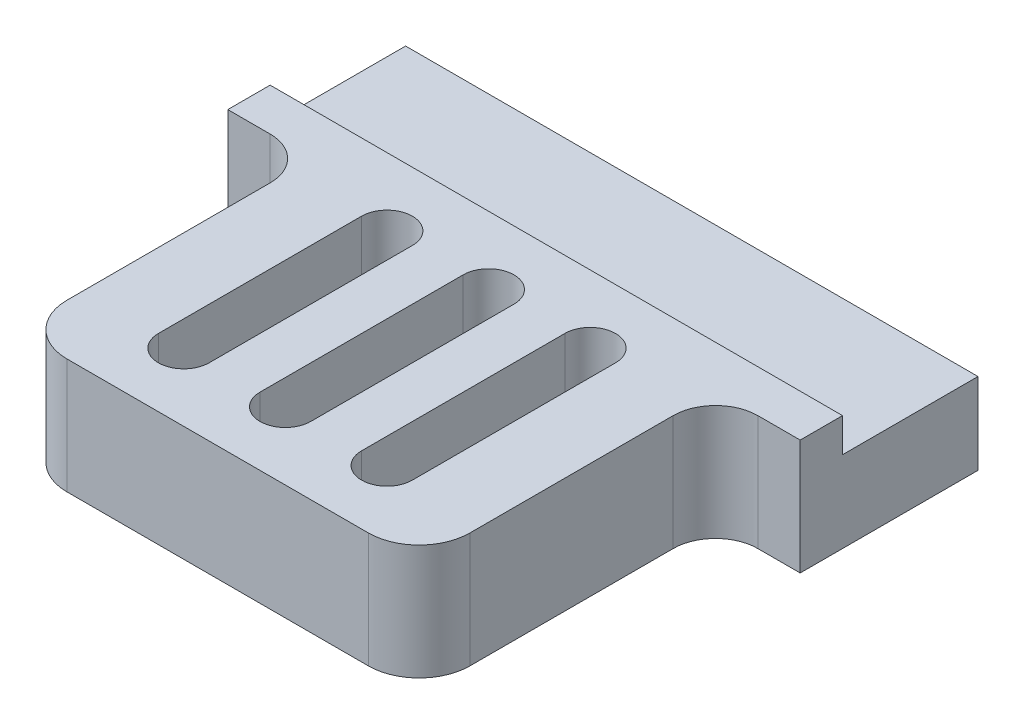
ISO-10303-21;
HEADER;
FILE_DESCRIPTION(('STEP AP214'),'2;1');
FILE_NAME('part.step','',(''),(''),'','','');
FILE_SCHEMA(('AUTOMOTIVE_DESIGN { 1 0 10303 214 1 1 1 1 }'));
ENDSEC;
DATA;
#1=APPLICATION_CONTEXT('core data for automotive mechanical design processes');
#2=APPLICATION_PROTOCOL_DEFINITION('international standard','automotive_design',2000,#1);
#3=PRODUCT_CONTEXT('',#1,'mechanical');
#4=PRODUCT('Part','Part','',(#3));
#5=PRODUCT_RELATED_PRODUCT_CATEGORY('part','',(#4));
#6=PRODUCT_DEFINITION_FORMATION('','',#4);
#7=PRODUCT_DEFINITION_CONTEXT('part definition',#1,'design');
#8=PRODUCT_DEFINITION('design','',#6,#7);
#9=PRODUCT_DEFINITION_SHAPE('','',#8);
#10=(LENGTH_UNIT() NAMED_UNIT(*) SI_UNIT(.MILLI.,.METRE.));
#11=(NAMED_UNIT(*) PLANE_ANGLE_UNIT() SI_UNIT($,.RADIAN.));
#12=(NAMED_UNIT(*) SI_UNIT($,.STERADIAN.) SOLID_ANGLE_UNIT());
#13=UNCERTAINTY_MEASURE_WITH_UNIT(LENGTH_MEASURE(1.E-05),#10,'distance_accuracy_value','');
#14=(GEOMETRIC_REPRESENTATION_CONTEXT(3) GLOBAL_UNCERTAINTY_ASSIGNED_CONTEXT((#13)) GLOBAL_UNIT_ASSIGNED_CONTEXT((#10,
#11,#12)) REPRESENTATION_CONTEXT('',''));
#15=CARTESIAN_POINT('',(0.,0.,0.));
#16=DIRECTION('',(0.,0.,1.));
#17=DIRECTION('',(1.,0.,0.));
#18=AXIS2_PLACEMENT_3D('',#15,#16,#17);
#19=CARTESIAN_POINT('',(-16.9,2.4,28.));
#20=DIRECTION('',(1.,0.,0.));
#21=DIRECTION('',(0.,0.,-1.));
#22=AXIS2_PLACEMENT_3D('',#19,#20,#21);
#23=PLANE('',#22);
#24=DIRECTION('',(0.,0.,-1.));
#25=VECTOR('',#24,1.);
#26=CARTESIAN_POINT('',(-16.9,-2.4,28.));
#27=LINE('',#26,#25);
#28=CARTESIAN_POINT('',(-16.9,-2.4,10.5));
#29=VERTEX_POINT('',#28);
#30=CARTESIAN_POINT('',(-16.9,-2.4,0.));
#31=VERTEX_POINT('',#30);
#32=EDGE_CURVE('E233',#29,#31,#27,.T.);
#33=ORIENTED_EDGE('',*,*,#32,.F.);
#34=DIRECTION('',(0.,1.,0.));
#35=VECTOR('',#34,1.);
#36=CARTESIAN_POINT('',(-16.9,-2.4,10.5));
#37=LINE('',#36,#35);
#38=CARTESIAN_POINT('',(-16.9,4.4,10.5));
#39=VERTEX_POINT('',#38);
#40=EDGE_CURVE('E294',#29,#39,#37,.T.);
#41=ORIENTED_EDGE('',*,*,#40,.T.);
#42=DIRECTION('',(0.,0.,1.));
#43=VECTOR('',#42,1.);
#44=CARTESIAN_POINT('',(-16.9,4.4,8.));
#45=LINE('',#44,#43);
#46=CARTESIAN_POINT('',(-16.9,4.4,8.));
#47=VERTEX_POINT('',#46);
#48=EDGE_CURVE('E409',#47,#39,#45,.T.);
#49=ORIENTED_EDGE('',*,*,#48,.F.);
#50=DIRECTION('',(0.,-1.,0.));
#51=VECTOR('',#50,1.);
#52=CARTESIAN_POINT('',(-16.9,2.4,8.));
#53=LINE('',#52,#51);
#54=CARTESIAN_POINT('',(-16.9,2.4,8.));
#55=VERTEX_POINT('',#54);
#56=EDGE_CURVE('E396',#47,#55,#53,.T.);
#57=ORIENTED_EDGE('',*,*,#56,.T.);
#58=DIRECTION('',(0.,0.,-1.));
#59=VECTOR('',#58,1.);
#60=CARTESIAN_POINT('',(-16.9,2.4,28.));
#61=LINE('',#60,#59);
#62=CARTESIAN_POINT('',(-16.9,2.4,0.));
#63=VERTEX_POINT('',#62);
#64=EDGE_CURVE('E238',#55,#63,#61,.T.);
#65=ORIENTED_EDGE('',*,*,#64,.T.);
#66=DIRECTION('',(0.,-1.,0.));
#67=VECTOR('',#66,1.);
#68=CARTESIAN_POINT('',(-16.9,2.4,0.));
#69=LINE('',#68,#67);
#70=EDGE_CURVE('E412',#63,#31,#69,.T.);
#71=ORIENTED_EDGE('',*,*,#70,.T.);
#72=EDGE_LOOP('',(#33,#41,#49,#57,#65,#71));
#73=FACE_BOUND('',#72,.T.);
#74=ADVANCED_FACE('F33',(#73),#23,.F.);
#75=CARTESIAN_POINT('',(-16.9,-2.4,28.));
#76=DIRECTION('',(0.,1.,0.));
#77=DIRECTION('',(-1.,0.,0.));
#78=AXIS2_PLACEMENT_3D('',#75,#76,#77);
#79=PLANE('',#78);
#80=DIRECTION('',(0.,0.,-1.));
#81=VECTOR('',#80,1.);
#82=CARTESIAN_POINT('',(7.5,-2.4,12.));
#83=LINE('',#82,#81);
#84=CARTESIAN_POINT('',(7.5,-2.4,24.));
#85=VERTEX_POINT('',#84);
#86=CARTESIAN_POINT('',(7.5,-2.4,12.));
#87=VERTEX_POINT('',#86);
#88=EDGE_CURVE('E310',#85,#87,#83,.T.);
#89=ORIENTED_EDGE('',*,*,#88,.T.);
#90=CARTESIAN_POINT('',(6.,-2.4,12.));
#91=DIRECTION('',(0.,1.,0.));
#92=DIRECTION('',(0.,0.,1.));
#93=AXIS2_PLACEMENT_3D('',#90,#91,#92);
#94=CIRCLE('',#93,1.5);
#95=CARTESIAN_POINT('',(4.5,-2.4,12.));
#96=VERTEX_POINT('',#95);
#97=EDGE_CURVE('E300',#87,#96,#94,.T.);
#98=ORIENTED_EDGE('',*,*,#97,.T.);
#99=DIRECTION('',(0.,0.,1.));
#100=VECTOR('',#99,1.);
#101=CARTESIAN_POINT('',(4.5,-2.4,12.));
#102=LINE('',#101,#100);
#103=CARTESIAN_POINT('',(4.5,-2.4,24.));
#104=VERTEX_POINT('',#103);
#105=EDGE_CURVE('E303',#96,#104,#102,.T.);
#106=ORIENTED_EDGE('',*,*,#105,.T.);
#107=CARTESIAN_POINT('',(6.,-2.4,24.));
#108=DIRECTION('',(0.,1.,0.));
#109=DIRECTION('',(0.,0.,1.));
#110=AXIS2_PLACEMENT_3D('',#107,#108,#109);
#111=CIRCLE('',#110,1.5);
#112=EDGE_CURVE('E307',#104,#85,#111,.T.);
#113=ORIENTED_EDGE('',*,*,#112,.T.);
#114=EDGE_LOOP('',(#89,#98,#106,#113));
#115=FACE_BOUND('',#114,.T.);
#116=DIRECTION('',(0.,0.,-1.));
#117=VECTOR('',#116,1.);
#118=CARTESIAN_POINT('',(-4.5,-2.4,12.));
#119=LINE('',#118,#117);
#120=CARTESIAN_POINT('',(-4.5,-2.4,24.));
#121=VERTEX_POINT('',#120);
#122=CARTESIAN_POINT('',(-4.5,-2.4,12.));
#123=VERTEX_POINT('',#122);
#124=EDGE_CURVE('E344',#121,#123,#119,.T.);
#125=ORIENTED_EDGE('',*,*,#124,.T.);
#126=CARTESIAN_POINT('',(-6.,-2.4,12.));
#127=DIRECTION('',(0.,1.,0.));
#128=DIRECTION('',(0.,0.,1.));
#129=AXIS2_PLACEMENT_3D('',#126,#127,#128);
#130=CIRCLE('',#129,1.5);
#131=CARTESIAN_POINT('',(-7.5,-2.4,12.));
#132=VERTEX_POINT('',#131);
#133=EDGE_CURVE('E334',#123,#132,#130,.T.);
#134=ORIENTED_EDGE('',*,*,#133,.T.);
#135=DIRECTION('',(0.,0.,1.));
#136=VECTOR('',#135,1.);
#137=CARTESIAN_POINT('',(-7.5,-2.4,12.));
#138=LINE('',#137,#136);
#139=CARTESIAN_POINT('',(-7.5,-2.4,24.));
#140=VERTEX_POINT('',#139);
#141=EDGE_CURVE('E337',#132,#140,#138,.T.);
#142=ORIENTED_EDGE('',*,*,#141,.T.);
#143=CARTESIAN_POINT('',(-6.,-2.4,24.));
#144=DIRECTION('',(0.,1.,0.));
#145=DIRECTION('',(0.,0.,1.));
#146=AXIS2_PLACEMENT_3D('',#143,#144,#145);
#147=CIRCLE('',#146,1.5);
#148=EDGE_CURVE('E341',#140,#121,#147,.T.);
#149=ORIENTED_EDGE('',*,*,#148,.T.);
#150=EDGE_LOOP('',(#125,#134,#142,#149));
#151=FACE_BOUND('',#150,.T.);
#152=DIRECTION('',(0.,0.,-1.));
#153=VECTOR('',#152,1.);
#154=CARTESIAN_POINT('',(1.5,-2.4,12.));
#155=LINE('',#154,#153);
#156=CARTESIAN_POINT('',(1.5,-2.4,24.));
#157=VERTEX_POINT('',#156);
#158=CARTESIAN_POINT('',(1.5,-2.4,12.));
#159=VERTEX_POINT('',#158);
#160=EDGE_CURVE('E374',#157,#159,#155,.T.);
#161=ORIENTED_EDGE('',*,*,#160,.T.);
#162=CARTESIAN_POINT('',(0.,-2.4,12.));
#163=DIRECTION('',(0.,1.,0.));
#164=DIRECTION('',(0.,0.,1.));
#165=AXIS2_PLACEMENT_3D('',#162,#163,#164);
#166=CIRCLE('',#165,1.5);
#167=CARTESIAN_POINT('',(-1.5,-2.4,12.));
#168=VERTEX_POINT('',#167);
#169=EDGE_CURVE('E364',#159,#168,#166,.T.);
#170=ORIENTED_EDGE('',*,*,#169,.T.);
#171=DIRECTION('',(0.,0.,1.));
#172=VECTOR('',#171,1.);
#173=CARTESIAN_POINT('',(-1.5,-2.4,12.));
#174=LINE('',#173,#172);
#175=CARTESIAN_POINT('',(-1.5,-2.4,24.));
#176=VERTEX_POINT('',#175);
#177=EDGE_CURVE('E367',#168,#176,#174,.T.);
#178=ORIENTED_EDGE('',*,*,#177,.T.);
#179=CARTESIAN_POINT('',(0.,-2.4,24.));
#180=DIRECTION('',(0.,1.,0.));
#181=DIRECTION('',(0.,0.,1.));
#182=AXIS2_PLACEMENT_3D('',#179,#180,#181);
#183=CIRCLE('',#182,1.5);
#184=EDGE_CURVE('E371',#176,#157,#183,.T.);
#185=ORIENTED_EDGE('',*,*,#184,.T.);
#186=EDGE_LOOP('',(#161,#170,#178,#185));
#187=FACE_BOUND('',#186,.T.);
#188=DIRECTION('',(-1.,0.,0.));
#189=VECTOR('',#188,1.);
#190=CARTESIAN_POINT('',(16.9,-2.4,10.5));
#191=LINE('',#190,#189);
#192=CARTESIAN_POINT('',(16.9,-2.4,10.5));
#193=VERTEX_POINT('',#192);
#194=CARTESIAN_POINT('',(14.4,-2.4,10.5));
#195=VERTEX_POINT('',#194);
#196=EDGE_CURVE('E205',#193,#195,#191,.T.);
#197=ORIENTED_EDGE('',*,*,#196,.T.);
#198=CARTESIAN_POINT('',(14.4,-2.4,13.));
#199=DIRECTION('',(0.,1.,0.));
#200=DIRECTION('',(-1.,0.,0.));
#201=AXIS2_PLACEMENT_3D('',#198,#199,#200);
#202=CIRCLE('',#201,2.5);
#203=CARTESIAN_POINT('',(11.9,-2.4,13.));
#204=VERTEX_POINT('',#203);
#205=EDGE_CURVE('E271',#195,#204,#202,.T.);
#206=ORIENTED_EDGE('',*,*,#205,.T.);
#207=DIRECTION('',(0.,0.,1.));
#208=VECTOR('',#207,1.);
#209=CARTESIAN_POINT('',(11.9,-2.4,10.5));
#210=LINE('',#209,#208);
#211=CARTESIAN_POINT('',(11.9,-2.4,25.));
#212=VERTEX_POINT('',#211);
#213=EDGE_CURVE('E216',#204,#212,#210,.T.);
#214=ORIENTED_EDGE('',*,*,#213,.T.);
#215=CARTESIAN_POINT('',(8.9,-2.4,25.));
#216=DIRECTION('',(0.,1.,0.));
#217=DIRECTION('',(-1.,0.,0.));
#218=AXIS2_PLACEMENT_3D('',#215,#216,#217);
#219=CIRCLE('',#218,3.);
#220=CARTESIAN_POINT('',(8.9,-2.4,28.));
#221=VERTEX_POINT('',#220);
#222=EDGE_CURVE('E256',#212,#221,#219,.F.);
#223=ORIENTED_EDGE('',*,*,#222,.T.);
#224=DIRECTION('',(1.,0.,0.));
#225=VECTOR('',#224,1.);
#226=CARTESIAN_POINT('',(-16.9,-2.4,28.));
#227=LINE('',#226,#225);
#228=CARTESIAN_POINT('',(-8.9,-2.4,28.));
#229=VERTEX_POINT('',#228);
#230=EDGE_CURVE('E414',#229,#221,#227,.T.);
#231=ORIENTED_EDGE('',*,*,#230,.F.);
#232=CARTESIAN_POINT('',(-8.9,-2.4,25.));
#233=DIRECTION('',(0.,1.,0.));
#234=DIRECTION('',(-1.,0.,0.));
#235=AXIS2_PLACEMENT_3D('',#232,#233,#234);
#236=CIRCLE('',#235,3.);
#237=CARTESIAN_POINT('',(-11.9,-2.4,25.));
#238=VERTEX_POINT('',#237);
#239=EDGE_CURVE('E254',#229,#238,#236,.F.);
#240=ORIENTED_EDGE('',*,*,#239,.T.);
#241=DIRECTION('',(0.,0.,-1.));
#242=VECTOR('',#241,1.);
#243=CARTESIAN_POINT('',(-11.9,-2.4,10.5));
#244=LINE('',#243,#242);
#245=CARTESIAN_POINT('',(-11.9,-2.4,13.));
#246=VERTEX_POINT('',#245);
#247=EDGE_CURVE('E289',#238,#246,#244,.T.);
#248=ORIENTED_EDGE('',*,*,#247,.T.);
#249=CARTESIAN_POINT('',(-14.4,-2.4,13.));
#250=DIRECTION('',(0.,1.,0.));
#251=DIRECTION('',(-1.,0.,0.));
#252=AXIS2_PLACEMENT_3D('',#249,#250,#251);
#253=CIRCLE('',#252,2.5);
#254=CARTESIAN_POINT('',(-14.4,-2.4,10.5));
#255=VERTEX_POINT('',#254);
#256=EDGE_CURVE('E11',#246,#255,#253,.T.);
#257=ORIENTED_EDGE('',*,*,#256,.T.);
#258=DIRECTION('',(-1.,0.,0.));
#259=VECTOR('',#258,1.);
#260=CARTESIAN_POINT('',(-16.9,-2.4,10.5));
#261=LINE('',#260,#259);
#262=EDGE_CURVE('E291',#255,#29,#261,.T.);
#263=ORIENTED_EDGE('',*,*,#262,.T.);
#264=ORIENTED_EDGE('',*,*,#32,.T.);
#265=DIRECTION('',(1.,0.,0.));
#266=VECTOR('',#265,1.);
#267=CARTESIAN_POINT('',(-16.9,-2.4,0.));
#268=LINE('',#267,#266);
#269=CARTESIAN_POINT('',(16.9,-2.4,0.));
#270=VERTEX_POINT('',#269);
#271=EDGE_CURVE('E231',#31,#270,#268,.T.);
#272=ORIENTED_EDGE('',*,*,#271,.T.);
#273=DIRECTION('',(0.,0.,-1.));
#274=VECTOR('',#273,1.);
#275=CARTESIAN_POINT('',(16.9,-2.4,28.));
#276=LINE('',#275,#274);
#277=EDGE_CURVE('E223',#193,#270,#276,.T.);
#278=ORIENTED_EDGE('',*,*,#277,.F.);
#279=EDGE_LOOP('',(#197,#206,#214,#223,#231,#240,#248,#257,#263,#264,#272,#278));
#280=FACE_BOUND('',#279,.T.);
#281=ADVANCED_FACE('F229',(#115,#151,#187,#280),#79,.F.);
#282=CARTESIAN_POINT('',(16.9,2.4,28.));
#283=DIRECTION('',(-1.,0.,0.));
#284=DIRECTION('',(0.,0.,1.));
#285=AXIS2_PLACEMENT_3D('',#282,#283,#284);
#286=PLANE('',#285);
#287=DIRECTION('',(0.,0.,1.));
#288=VECTOR('',#287,1.);
#289=CARTESIAN_POINT('',(16.9,4.4,8.));
#290=LINE('',#289,#288);
#291=CARTESIAN_POINT('',(16.9,4.4,8.));
#292=VERTEX_POINT('',#291);
#293=CARTESIAN_POINT('',(16.9,4.4,10.5));
#294=VERTEX_POINT('',#293);
#295=EDGE_CURVE('E226',#292,#294,#290,.T.);
#296=ORIENTED_EDGE('',*,*,#295,.T.);
#297=DIRECTION('',(0.,1.,0.));
#298=VECTOR('',#297,1.);
#299=CARTESIAN_POINT('',(16.9,-2.4,10.5));
#300=LINE('',#299,#298);
#301=EDGE_CURVE('E209',#193,#294,#300,.T.);
#302=ORIENTED_EDGE('',*,*,#301,.F.);
#303=ORIENTED_EDGE('',*,*,#277,.T.);
#304=DIRECTION('',(0.,1.,0.));
#305=VECTOR('',#304,1.);
#306=CARTESIAN_POINT('',(16.9,2.4,0.));
#307=LINE('',#306,#305);
#308=CARTESIAN_POINT('',(16.9,2.4,0.));
#309=VERTEX_POINT('',#308);
#310=EDGE_CURVE('E421',#270,#309,#307,.T.);
#311=ORIENTED_EDGE('',*,*,#310,.T.);
#312=DIRECTION('',(0.,0.,-1.));
#313=VECTOR('',#312,1.);
#314=CARTESIAN_POINT('',(16.9,2.4,28.));
#315=LINE('',#314,#313);
#316=CARTESIAN_POINT('',(16.9,2.4,8.));
#317=VERTEX_POINT('',#316);
#318=EDGE_CURVE('E234',#317,#309,#315,.T.);
#319=ORIENTED_EDGE('',*,*,#318,.F.);
#320=DIRECTION('',(0.,1.,0.));
#321=VECTOR('',#320,1.);
#322=CARTESIAN_POINT('',(16.9,2.4,8.));
#323=LINE('',#322,#321);
#324=EDGE_CURVE('E402',#317,#292,#323,.T.);
#325=ORIENTED_EDGE('',*,*,#324,.T.);
#326=EDGE_LOOP('',(#296,#302,#303,#311,#319,#325));
#327=FACE_BOUND('',#326,.T.);
#328=ADVANCED_FACE('F221',(#327),#286,.F.);
#329=CARTESIAN_POINT('',(-16.9,2.4,28.));
#330=DIRECTION('',(0.,-1.,0.));
#331=DIRECTION('',(1.,0.,0.));
#332=AXIS2_PLACEMENT_3D('',#329,#330,#331);
#333=PLANE('',#332);
#334=ORIENTED_EDGE('',*,*,#64,.F.);
#335=DIRECTION('',(1.,0.,0.));
#336=VECTOR('',#335,1.);
#337=CARTESIAN_POINT('',(-16.9,2.4,8.));
#338=LINE('',#337,#336);
#339=EDGE_CURVE('E399',#55,#317,#338,.T.);
#340=ORIENTED_EDGE('',*,*,#339,.T.);
#341=ORIENTED_EDGE('',*,*,#318,.T.);
#342=DIRECTION('',(-1.,0.,0.));
#343=VECTOR('',#342,1.);
#344=CARTESIAN_POINT('',(-16.9,2.4,0.));
#345=LINE('',#344,#343);
#346=EDGE_CURVE('E417',#309,#63,#345,.T.);
#347=ORIENTED_EDGE('',*,*,#346,.T.);
#348=EDGE_LOOP('',(#334,#340,#341,#347));
#349=FACE_BOUND('',#348,.T.);
#350=ADVANCED_FACE('F431',(#349),#333,.F.);
#351=CARTESIAN_POINT('',(0.,0.,28.));
#352=DIRECTION('',(0.,0.,1.));
#353=DIRECTION('',(1.,0.,0.));
#354=AXIS2_PLACEMENT_3D('',#351,#352,#353);
#355=PLANE('',#354);
#356=ORIENTED_EDGE('',*,*,#230,.T.);
#357=DIRECTION('',(0.,1.,0.));
#358=VECTOR('',#357,1.);
#359=CARTESIAN_POINT('',(8.9,4.4,28.));
#360=LINE('',#359,#358);
#361=CARTESIAN_POINT('',(8.9,4.4,28.));
#362=VERTEX_POINT('',#361);
#363=EDGE_CURVE('E243',#221,#362,#360,.T.);
#364=ORIENTED_EDGE('',*,*,#363,.T.);
#365=DIRECTION('',(-1.,0.,0.));
#366=VECTOR('',#365,1.);
#367=CARTESIAN_POINT('',(-16.9,4.4,28.));
#368=LINE('',#367,#366);
#369=CARTESIAN_POINT('',(-8.9,4.4,28.));
#370=VERTEX_POINT('',#369);
#371=EDGE_CURVE('E389',#362,#370,#368,.T.);
#372=ORIENTED_EDGE('',*,*,#371,.T.);
#373=DIRECTION('',(0.,1.,0.));
#374=VECTOR('',#373,1.);
#375=CARTESIAN_POINT('',(-8.9,-2.4,28.));
#376=LINE('',#375,#374);
#377=EDGE_CURVE('E236',#370,#229,#376,.F.);
#378=ORIENTED_EDGE('',*,*,#377,.T.);
#379=EDGE_LOOP('',(#356,#364,#372,#378));
#380=FACE_BOUND('',#379,.T.);
#381=ADVANCED_FACE('F453',(#380),#355,.T.);
#382=CARTESIAN_POINT('',(0.,0.,0.));
#383=DIRECTION('',(0.,0.,1.));
#384=DIRECTION('',(1.,0.,0.));
#385=AXIS2_PLACEMENT_3D('',#382,#383,#384);
#386=PLANE('',#385);
#387=ORIENTED_EDGE('',*,*,#70,.F.);
#388=ORIENTED_EDGE('',*,*,#346,.F.);
#389=ORIENTED_EDGE('',*,*,#310,.F.);
#390=ORIENTED_EDGE('',*,*,#271,.F.);
#391=EDGE_LOOP('',(#387,#388,#389,#390));
#392=FACE_BOUND('',#391,.T.);
#393=ADVANCED_FACE('F434',(#392),#386,.F.);
#394=CARTESIAN_POINT('',(-16.9,4.4,8.));
#395=DIRECTION('',(0.,1.,0.));
#396=DIRECTION('',(0.,0.,1.));
#397=AXIS2_PLACEMENT_3D('',#394,#395,#396);
#398=PLANE('',#397);
#399=ORIENTED_EDGE('',*,*,#371,.F.);
#400=CARTESIAN_POINT('',(8.9,4.4,25.));
#401=DIRECTION('',(0.,1.,0.));
#402=DIRECTION('',(0.,0.,1.));
#403=AXIS2_PLACEMENT_3D('',#400,#401,#402);
#404=CIRCLE('',#403,3.);
#405=CARTESIAN_POINT('',(11.9,4.4,25.));
#406=VERTEX_POINT('',#405);
#407=EDGE_CURVE('E248',#362,#406,#404,.T.);
#408=ORIENTED_EDGE('',*,*,#407,.T.);
#409=DIRECTION('',(0.,0.,1.));
#410=VECTOR('',#409,1.);
#411=CARTESIAN_POINT('',(11.9,4.4,10.5));
#412=LINE('',#411,#410);
#413=CARTESIAN_POINT('',(11.9,4.4,13.));
#414=VERTEX_POINT('',#413);
#415=EDGE_CURVE('E217',#414,#406,#412,.T.);
#416=ORIENTED_EDGE('',*,*,#415,.F.);
#417=CARTESIAN_POINT('',(14.4,4.4,13.));
#418=DIRECTION('',(0.,1.,0.));
#419=DIRECTION('',(0.,0.,1.));
#420=AXIS2_PLACEMENT_3D('',#417,#418,#419);
#421=CIRCLE('',#420,2.5);
#422=CARTESIAN_POINT('',(14.4,4.4,10.5));
#423=VERTEX_POINT('',#422);
#424=EDGE_CURVE('E269',#414,#423,#421,.F.);
#425=ORIENTED_EDGE('',*,*,#424,.T.);
#426=DIRECTION('',(-1.,0.,0.));
#427=VECTOR('',#426,1.);
#428=CARTESIAN_POINT('',(16.9,4.4,10.5));
#429=LINE('',#428,#427);
#430=EDGE_CURVE('E285',#294,#423,#429,.T.);
#431=ORIENTED_EDGE('',*,*,#430,.F.);
#432=ORIENTED_EDGE('',*,*,#295,.F.);
#433=DIRECTION('',(-1.,0.,0.));
#434=VECTOR('',#433,1.);
#435=CARTESIAN_POINT('',(-16.9,4.4,8.));
#436=LINE('',#435,#434);
#437=EDGE_CURVE('E404',#292,#47,#436,.T.);
#438=ORIENTED_EDGE('',*,*,#437,.T.);
#439=ORIENTED_EDGE('',*,*,#48,.T.);
#440=DIRECTION('',(-1.,0.,0.));
#441=VECTOR('',#440,1.);
#442=CARTESIAN_POINT('',(-16.9,4.4,10.5));
#443=LINE('',#442,#441);
#444=CARTESIAN_POINT('',(-14.4,4.4,10.5));
#445=VERTEX_POINT('',#444);
#446=EDGE_CURVE('E292',#445,#39,#443,.T.);
#447=ORIENTED_EDGE('',*,*,#446,.F.);
#448=CARTESIAN_POINT('',(-14.4,4.4,13.));
#449=DIRECTION('',(0.,1.,0.));
#450=DIRECTION('',(0.,0.,1.));
#451=AXIS2_PLACEMENT_3D('',#448,#449,#450);
#452=CIRCLE('',#451,2.5);
#453=CARTESIAN_POINT('',(-11.9,4.4,13.));
#454=VERTEX_POINT('',#453);
#455=EDGE_CURVE('E41',#445,#454,#452,.F.);
#456=ORIENTED_EDGE('',*,*,#455,.T.);
#457=DIRECTION('',(0.,0.,-1.));
#458=VECTOR('',#457,1.);
#459=CARTESIAN_POINT('',(-11.9,4.4,10.5));
#460=LINE('',#459,#458);
#461=CARTESIAN_POINT('',(-11.9,4.4,25.));
#462=VERTEX_POINT('',#461);
#463=EDGE_CURVE('E227',#462,#454,#460,.T.);
#464=ORIENTED_EDGE('',*,*,#463,.F.);
#465=CARTESIAN_POINT('',(-8.9,4.4,25.));
#466=DIRECTION('',(0.,1.,0.));
#467=DIRECTION('',(0.,0.,1.));
#468=AXIS2_PLACEMENT_3D('',#465,#466,#467);
#469=CIRCLE('',#468,3.);
#470=EDGE_CURVE('E246',#462,#370,#469,.T.);
#471=ORIENTED_EDGE('',*,*,#470,.T.);
#472=EDGE_LOOP('',(#399,#408,#416,#425,#431,#432,#438,#439,#447,#456,#464,#471));
#473=FACE_BOUND('',#472,.T.);
#474=CARTESIAN_POINT('',(6.,4.4,12.));
#475=DIRECTION('',(0.,1.,0.));
#476=DIRECTION('',(0.,0.,1.));
#477=AXIS2_PLACEMENT_3D('',#474,#475,#476);
#478=CIRCLE('',#477,1.5);
#479=CARTESIAN_POINT('',(7.5,4.4,12.));
#480=VERTEX_POINT('',#479);
#481=CARTESIAN_POINT('',(4.5,4.4,12.));
#482=VERTEX_POINT('',#481);
#483=EDGE_CURVE('E314',#480,#482,#478,.T.);
#484=ORIENTED_EDGE('',*,*,#483,.F.);
#485=DIRECTION('',(0.,0.,-1.));
#486=VECTOR('',#485,1.);
#487=CARTESIAN_POINT('',(7.5,4.4,12.));
#488=LINE('',#487,#486);
#489=CARTESIAN_POINT('',(7.5,4.4,24.));
#490=VERTEX_POINT('',#489);
#491=EDGE_CURVE('E304',#490,#480,#488,.T.);
#492=ORIENTED_EDGE('',*,*,#491,.F.);
#493=CARTESIAN_POINT('',(6.,4.4,24.));
#494=DIRECTION('',(0.,1.,0.));
#495=DIRECTION('',(0.,0.,1.));
#496=AXIS2_PLACEMENT_3D('',#493,#494,#495);
#497=CIRCLE('',#496,1.5);
#498=CARTESIAN_POINT('',(4.5,4.4,24.));
#499=VERTEX_POINT('',#498);
#500=EDGE_CURVE('E320',#499,#490,#497,.T.);
#501=ORIENTED_EDGE('',*,*,#500,.F.);
#502=DIRECTION('',(0.,0.,1.));
#503=VECTOR('',#502,1.);
#504=CARTESIAN_POINT('',(4.5,4.4,12.));
#505=LINE('',#504,#503);
#506=EDGE_CURVE('E316',#482,#499,#505,.T.);
#507=ORIENTED_EDGE('',*,*,#506,.F.);
#508=EDGE_LOOP('',(#484,#492,#501,#507));
#509=FACE_BOUND('',#508,.T.);
#510=CARTESIAN_POINT('',(-6.,4.4,12.));
#511=DIRECTION('',(0.,1.,0.));
#512=DIRECTION('',(0.,0.,1.));
#513=AXIS2_PLACEMENT_3D('',#510,#511,#512);
#514=CIRCLE('',#513,1.5);
#515=CARTESIAN_POINT('',(-4.5,4.4,12.));
#516=VERTEX_POINT('',#515);
#517=CARTESIAN_POINT('',(-7.5,4.4,12.));
#518=VERTEX_POINT('',#517);
#519=EDGE_CURVE('E299',#516,#518,#514,.T.);
#520=ORIENTED_EDGE('',*,*,#519,.F.);
#521=DIRECTION('',(0.,0.,-1.));
#522=VECTOR('',#521,1.);
#523=CARTESIAN_POINT('',(-4.5,4.4,12.));
#524=LINE('',#523,#522);
#525=CARTESIAN_POINT('',(-4.5,4.4,24.));
#526=VERTEX_POINT('',#525);
#527=EDGE_CURVE('E338',#526,#516,#524,.T.);
#528=ORIENTED_EDGE('',*,*,#527,.F.);
#529=CARTESIAN_POINT('',(-6.,4.4,24.));
#530=DIRECTION('',(0.,1.,0.));
#531=DIRECTION('',(0.,0.,1.));
#532=AXIS2_PLACEMENT_3D('',#529,#530,#531);
#533=CIRCLE('',#532,1.5);
#534=CARTESIAN_POINT('',(-7.5,4.4,24.));
#535=VERTEX_POINT('',#534);
#536=EDGE_CURVE('E352',#535,#526,#533,.T.);
#537=ORIENTED_EDGE('',*,*,#536,.F.);
#538=DIRECTION('',(0.,0.,1.));
#539=VECTOR('',#538,1.);
#540=CARTESIAN_POINT('',(-7.5,4.4,12.));
#541=LINE('',#540,#539);
#542=EDGE_CURVE('E349',#518,#535,#541,.T.);
#543=ORIENTED_EDGE('',*,*,#542,.F.);
#544=EDGE_LOOP('',(#520,#528,#537,#543));
#545=FACE_BOUND('',#544,.T.);
#546=CARTESIAN_POINT('',(0.,4.4,12.));
#547=DIRECTION('',(0.,1.,0.));
#548=DIRECTION('',(0.,0.,1.));
#549=AXIS2_PLACEMENT_3D('',#546,#547,#548);
#550=CIRCLE('',#549,1.5);
#551=CARTESIAN_POINT('',(1.5,4.4,12.));
#552=VERTEX_POINT('',#551);
#553=CARTESIAN_POINT('',(-1.5,4.4,12.));
#554=VERTEX_POINT('',#553);
#555=EDGE_CURVE('E327',#552,#554,#550,.T.);
#556=ORIENTED_EDGE('',*,*,#555,.F.);
#557=DIRECTION('',(0.,0.,-1.));
#558=VECTOR('',#557,1.);
#559=CARTESIAN_POINT('',(1.5,4.4,12.));
#560=LINE('',#559,#558);
#561=CARTESIAN_POINT('',(1.5,4.4,24.));
#562=VERTEX_POINT('',#561);
#563=EDGE_CURVE('E368',#562,#552,#560,.T.);
#564=ORIENTED_EDGE('',*,*,#563,.F.);
#565=CARTESIAN_POINT('',(0.,4.4,24.));
#566=DIRECTION('',(0.,1.,0.));
#567=DIRECTION('',(0.,0.,1.));
#568=AXIS2_PLACEMENT_3D('',#565,#566,#567);
#569=CIRCLE('',#568,1.5);
#570=CARTESIAN_POINT('',(-1.5,4.4,24.));
#571=VERTEX_POINT('',#570);
#572=EDGE_CURVE('E382',#571,#562,#569,.T.);
#573=ORIENTED_EDGE('',*,*,#572,.F.);
#574=DIRECTION('',(0.,0.,1.));
#575=VECTOR('',#574,1.);
#576=CARTESIAN_POINT('',(-1.5,4.4,12.));
#577=LINE('',#576,#575);
#578=EDGE_CURVE('E379',#554,#571,#577,.T.);
#579=ORIENTED_EDGE('',*,*,#578,.F.);
#580=EDGE_LOOP('',(#556,#564,#573,#579));
#581=FACE_BOUND('',#580,.T.);
#582=ADVANCED_FACE('F283',(#473,#509,#545,#581),#398,.T.);
#583=CARTESIAN_POINT('',(0.,0.,8.));
#584=DIRECTION('',(0.,0.,-1.));
#585=DIRECTION('',(-1.,0.,0.));
#586=AXIS2_PLACEMENT_3D('',#583,#584,#585);
#587=PLANE('',#586);
#588=ORIENTED_EDGE('',*,*,#56,.F.);
#589=ORIENTED_EDGE('',*,*,#437,.F.);
#590=ORIENTED_EDGE('',*,*,#324,.F.);
#591=ORIENTED_EDGE('',*,*,#339,.F.);
#592=EDGE_LOOP('',(#588,#589,#590,#591));
#593=FACE_BOUND('',#592,.T.);
#594=ADVANCED_FACE('F437',(#593),#587,.T.);
#595=CARTESIAN_POINT('',(0.,-2.4,12.));
#596=DIRECTION('',(0.,1.,0.));
#597=DIRECTION('',(0.,0.,1.));
#598=AXIS2_PLACEMENT_3D('',#595,#596,#597);
#599=CYLINDRICAL_SURFACE('',#598,1.5);
#600=ORIENTED_EDGE('',*,*,#555,.T.);
#601=DIRECTION('',(0.,1.,0.));
#602=VECTOR('',#601,1.);
#603=CARTESIAN_POINT('',(-1.5,-2.4,12.));
#604=LINE('',#603,#602);
#605=EDGE_CURVE('E377',#168,#554,#604,.T.);
#606=ORIENTED_EDGE('',*,*,#605,.F.);
#607=ORIENTED_EDGE('',*,*,#169,.F.);
#608=DIRECTION('',(0.,1.,0.));
#609=VECTOR('',#608,1.);
#610=CARTESIAN_POINT('',(1.5,-2.4,12.));
#611=LINE('',#610,#609);
#612=EDGE_CURVE('E387',#159,#552,#611,.T.);
#613=ORIENTED_EDGE('',*,*,#612,.T.);
#614=EDGE_LOOP('',(#600,#606,#607,#613));
#615=FACE_BOUND('',#614,.T.);
#616=ADVANCED_FACE('F485',(#615),#599,.F.);
#617=CARTESIAN_POINT('',(1.5,-2.4,12.));
#618=DIRECTION('',(1.,0.,0.));
#619=DIRECTION('',(0.,0.,-1.));
#620=AXIS2_PLACEMENT_3D('',#617,#618,#619);
#621=PLANE('',#620);
#622=ORIENTED_EDGE('',*,*,#563,.T.);
#623=ORIENTED_EDGE('',*,*,#612,.F.);
#624=ORIENTED_EDGE('',*,*,#160,.F.);
#625=DIRECTION('',(0.,1.,0.));
#626=VECTOR('',#625,1.);
#627=CARTESIAN_POINT('',(1.5,-2.4,24.));
#628=LINE('',#627,#626);
#629=EDGE_CURVE('E390',#157,#562,#628,.T.);
#630=ORIENTED_EDGE('',*,*,#629,.T.);
#631=EDGE_LOOP('',(#622,#623,#624,#630));
#632=FACE_BOUND('',#631,.T.);
#633=ADVANCED_FACE('F488',(#632),#621,.F.);
#634=CARTESIAN_POINT('',(0.,-2.4,24.));
#635=DIRECTION('',(0.,1.,0.));
#636=DIRECTION('',(0.,0.,1.));
#637=AXIS2_PLACEMENT_3D('',#634,#635,#636);
#638=CYLINDRICAL_SURFACE('',#637,1.5);
#639=ORIENTED_EDGE('',*,*,#572,.T.);
#640=ORIENTED_EDGE('',*,*,#629,.F.);
#641=ORIENTED_EDGE('',*,*,#184,.F.);
#642=DIRECTION('',(0.,1.,0.));
#643=VECTOR('',#642,1.);
#644=CARTESIAN_POINT('',(-1.5,-2.4,24.));
#645=LINE('',#644,#643);
#646=EDGE_CURVE('E392',#176,#571,#645,.T.);
#647=ORIENTED_EDGE('',*,*,#646,.T.);
#648=EDGE_LOOP('',(#639,#640,#641,#647));
#649=FACE_BOUND('',#648,.T.);
#650=ADVANCED_FACE('F494',(#649),#638,.F.);
#651=CARTESIAN_POINT('',(-1.5,-2.4,12.));
#652=DIRECTION('',(-1.,0.,0.));
#653=DIRECTION('',(0.,0.,1.));
#654=AXIS2_PLACEMENT_3D('',#651,#652,#653);
#655=PLANE('',#654);
#656=ORIENTED_EDGE('',*,*,#578,.T.);
#657=ORIENTED_EDGE('',*,*,#646,.F.);
#658=ORIENTED_EDGE('',*,*,#177,.F.);
#659=ORIENTED_EDGE('',*,*,#605,.T.);
#660=EDGE_LOOP('',(#656,#657,#658,#659));
#661=FACE_BOUND('',#660,.T.);
#662=ADVANCED_FACE('F490',(#661),#655,.F.);
#663=CARTESIAN_POINT('',(-6.,-2.4,12.));
#664=DIRECTION('',(0.,1.,0.));
#665=DIRECTION('',(0.,0.,1.));
#666=AXIS2_PLACEMENT_3D('',#663,#664,#665);
#667=CYLINDRICAL_SURFACE('',#666,1.5);
#668=ORIENTED_EDGE('',*,*,#519,.T.);
#669=DIRECTION('',(0.,1.,0.));
#670=VECTOR('',#669,1.);
#671=CARTESIAN_POINT('',(-7.5,-2.4,12.));
#672=LINE('',#671,#670);
#673=EDGE_CURVE('E347',#132,#518,#672,.T.);
#674=ORIENTED_EDGE('',*,*,#673,.F.);
#675=ORIENTED_EDGE('',*,*,#133,.F.);
#676=DIRECTION('',(0.,1.,0.));
#677=VECTOR('',#676,1.);
#678=CARTESIAN_POINT('',(-4.5,-2.4,12.));
#679=LINE('',#678,#677);
#680=EDGE_CURVE('E317',#123,#516,#679,.T.);
#681=ORIENTED_EDGE('',*,*,#680,.T.);
#682=EDGE_LOOP('',(#668,#674,#675,#681));
#683=FACE_BOUND('',#682,.T.);
#684=ADVANCED_FACE('F493',(#683),#667,.F.);
#685=CARTESIAN_POINT('',(-4.5,-2.4,12.));
#686=DIRECTION('',(1.,0.,0.));
#687=DIRECTION('',(0.,0.,-1.));
#688=AXIS2_PLACEMENT_3D('',#685,#686,#687);
#689=PLANE('',#688);
#690=ORIENTED_EDGE('',*,*,#527,.T.);
#691=ORIENTED_EDGE('',*,*,#680,.F.);
#692=ORIENTED_EDGE('',*,*,#124,.F.);
#693=DIRECTION('',(0.,1.,0.));
#694=VECTOR('',#693,1.);
#695=CARTESIAN_POINT('',(-4.5,-2.4,24.));
#696=LINE('',#695,#694);
#697=EDGE_CURVE('E358',#121,#526,#696,.T.);
#698=ORIENTED_EDGE('',*,*,#697,.T.);
#699=EDGE_LOOP('',(#690,#691,#692,#698));
#700=FACE_BOUND('',#699,.T.);
#701=ADVANCED_FACE('F504',(#700),#689,.F.);
#702=CARTESIAN_POINT('',(-6.,-2.4,24.));
#703=DIRECTION('',(0.,1.,0.));
#704=DIRECTION('',(0.,0.,1.));
#705=AXIS2_PLACEMENT_3D('',#702,#703,#704);
#706=CYLINDRICAL_SURFACE('',#705,1.5);
#707=ORIENTED_EDGE('',*,*,#536,.T.);
#708=ORIENTED_EDGE('',*,*,#697,.F.);
#709=ORIENTED_EDGE('',*,*,#148,.F.);
#710=DIRECTION('',(0.,1.,0.));
#711=VECTOR('',#710,1.);
#712=CARTESIAN_POINT('',(-7.5,-2.4,24.));
#713=LINE('',#712,#711);
#714=EDGE_CURVE('E360',#140,#535,#713,.T.);
#715=ORIENTED_EDGE('',*,*,#714,.T.);
#716=EDGE_LOOP('',(#707,#708,#709,#715));
#717=FACE_BOUND('',#716,.T.);
#718=ADVANCED_FACE('F510',(#717),#706,.F.);
#719=CARTESIAN_POINT('',(-7.5,-2.4,12.));
#720=DIRECTION('',(-1.,0.,0.));
#721=DIRECTION('',(0.,0.,1.));
#722=AXIS2_PLACEMENT_3D('',#719,#720,#721);
#723=PLANE('',#722);
#724=ORIENTED_EDGE('',*,*,#542,.T.);
#725=ORIENTED_EDGE('',*,*,#714,.F.);
#726=ORIENTED_EDGE('',*,*,#141,.F.);
#727=ORIENTED_EDGE('',*,*,#673,.T.);
#728=EDGE_LOOP('',(#724,#725,#726,#727));
#729=FACE_BOUND('',#728,.T.);
#730=ADVANCED_FACE('F506',(#729),#723,.F.);
#731=CARTESIAN_POINT('',(6.,-2.4,12.));
#732=DIRECTION('',(0.,1.,0.));
#733=DIRECTION('',(0.,0.,1.));
#734=AXIS2_PLACEMENT_3D('',#731,#732,#733);
#735=CYLINDRICAL_SURFACE('',#734,1.5);
#736=ORIENTED_EDGE('',*,*,#483,.T.);
#737=DIRECTION('',(0.,1.,0.));
#738=VECTOR('',#737,1.);
#739=CARTESIAN_POINT('',(4.5,-2.4,12.));
#740=LINE('',#739,#738);
#741=EDGE_CURVE('E313',#96,#482,#740,.T.);
#742=ORIENTED_EDGE('',*,*,#741,.F.);
#743=ORIENTED_EDGE('',*,*,#97,.F.);
#744=DIRECTION('',(0.,1.,0.));
#745=VECTOR('',#744,1.);
#746=CARTESIAN_POINT('',(7.5,-2.4,12.));
#747=LINE('',#746,#745);
#748=EDGE_CURVE('E325',#87,#480,#747,.T.);
#749=ORIENTED_EDGE('',*,*,#748,.T.);
#750=EDGE_LOOP('',(#736,#742,#743,#749));
#751=FACE_BOUND('',#750,.T.);
#752=ADVANCED_FACE('F509',(#751),#735,.F.);
#753=CARTESIAN_POINT('',(7.5,-2.4,12.));
#754=DIRECTION('',(1.,0.,0.));
#755=DIRECTION('',(0.,0.,-1.));
#756=AXIS2_PLACEMENT_3D('',#753,#754,#755);
#757=PLANE('',#756);
#758=ORIENTED_EDGE('',*,*,#491,.T.);
#759=ORIENTED_EDGE('',*,*,#748,.F.);
#760=ORIENTED_EDGE('',*,*,#88,.F.);
#761=DIRECTION('',(0.,1.,0.));
#762=VECTOR('',#761,1.);
#763=CARTESIAN_POINT('',(7.5,-2.4,24.));
#764=LINE('',#763,#762);
#765=EDGE_CURVE('E328',#85,#490,#764,.T.);
#766=ORIENTED_EDGE('',*,*,#765,.T.);
#767=EDGE_LOOP('',(#758,#759,#760,#766));
#768=FACE_BOUND('',#767,.T.);
#769=ADVANCED_FACE('F520',(#768),#757,.F.);
#770=CARTESIAN_POINT('',(6.,-2.4,24.));
#771=DIRECTION('',(0.,1.,0.));
#772=DIRECTION('',(0.,0.,1.));
#773=AXIS2_PLACEMENT_3D('',#770,#771,#772);
#774=CYLINDRICAL_SURFACE('',#773,1.5);
#775=ORIENTED_EDGE('',*,*,#500,.T.);
#776=ORIENTED_EDGE('',*,*,#765,.F.);
#777=ORIENTED_EDGE('',*,*,#112,.F.);
#778=DIRECTION('',(0.,1.,0.));
#779=VECTOR('',#778,1.);
#780=CARTESIAN_POINT('',(4.5,-2.4,24.));
#781=LINE('',#780,#779);
#782=EDGE_CURVE('E330',#104,#499,#781,.T.);
#783=ORIENTED_EDGE('',*,*,#782,.T.);
#784=EDGE_LOOP('',(#775,#776,#777,#783));
#785=FACE_BOUND('',#784,.T.);
#786=ADVANCED_FACE('F525',(#785),#774,.F.);
#787=CARTESIAN_POINT('',(4.5,-2.4,12.));
#788=DIRECTION('',(-1.,0.,0.));
#789=DIRECTION('',(0.,0.,1.));
#790=AXIS2_PLACEMENT_3D('',#787,#788,#789);
#791=PLANE('',#790);
#792=ORIENTED_EDGE('',*,*,#506,.T.);
#793=ORIENTED_EDGE('',*,*,#782,.F.);
#794=ORIENTED_EDGE('',*,*,#105,.F.);
#795=ORIENTED_EDGE('',*,*,#741,.T.);
#796=EDGE_LOOP('',(#792,#793,#794,#795));
#797=FACE_BOUND('',#796,.T.);
#798=ADVANCED_FACE('F522',(#797),#791,.F.);
#799=CARTESIAN_POINT('',(-16.9,-2.4,10.5));
#800=DIRECTION('',(0.,0.,-1.));
#801=DIRECTION('',(-1.,0.,0.));
#802=AXIS2_PLACEMENT_3D('',#799,#800,#801);
#803=PLANE('',#802);
#804=ORIENTED_EDGE('',*,*,#262,.F.);
#805=DIRECTION('',(0.,1.,0.));
#806=VECTOR('',#805,1.);
#807=CARTESIAN_POINT('',(-14.4,4.4,10.5));
#808=LINE('',#807,#806);
#809=EDGE_CURVE('E265',#255,#445,#808,.T.);
#810=ORIENTED_EDGE('',*,*,#809,.T.);
#811=ORIENTED_EDGE('',*,*,#446,.T.);
#812=ORIENTED_EDGE('',*,*,#40,.F.);
#813=EDGE_LOOP('',(#804,#810,#811,#812));
#814=FACE_BOUND('',#813,.T.);
#815=ADVANCED_FACE('F441',(#814),#803,.F.);
#816=CARTESIAN_POINT('',(-11.9,-2.4,10.5));
#817=DIRECTION('',(1.,0.,0.));
#818=DIRECTION('',(0.,0.,-1.));
#819=AXIS2_PLACEMENT_3D('',#816,#817,#818);
#820=PLANE('',#819);
#821=ORIENTED_EDGE('',*,*,#463,.T.);
#822=DIRECTION('',(0.,1.,0.));
#823=VECTOR('',#822,1.);
#824=CARTESIAN_POINT('',(-11.9,-2.4,13.));
#825=LINE('',#824,#823);
#826=EDGE_CURVE('E54',#454,#246,#825,.F.);
#827=ORIENTED_EDGE('',*,*,#826,.T.);
#828=ORIENTED_EDGE('',*,*,#247,.F.);
#829=DIRECTION('',(0.,1.,0.));
#830=VECTOR('',#829,1.);
#831=CARTESIAN_POINT('',(-11.9,4.4,25.));
#832=LINE('',#831,#830);
#833=EDGE_CURVE('E258',#238,#462,#832,.T.);
#834=ORIENTED_EDGE('',*,*,#833,.T.);
#835=EDGE_LOOP('',(#821,#827,#828,#834));
#836=FACE_BOUND('',#835,.T.);
#837=ADVANCED_FACE('F448',(#836),#820,.F.);
#838=CARTESIAN_POINT('',(16.9,-2.4,10.5));
#839=DIRECTION('',(0.,0.,-1.));
#840=DIRECTION('',(-1.,0.,0.));
#841=AXIS2_PLACEMENT_3D('',#838,#839,#840);
#842=PLANE('',#841);
#843=ORIENTED_EDGE('',*,*,#430,.T.);
#844=DIRECTION('',(0.,1.,0.));
#845=VECTOR('',#844,1.);
#846=CARTESIAN_POINT('',(14.4,-2.4,10.5));
#847=LINE('',#846,#845);
#848=EDGE_CURVE('E212',#423,#195,#847,.F.);
#849=ORIENTED_EDGE('',*,*,#848,.T.);
#850=ORIENTED_EDGE('',*,*,#196,.F.);
#851=ORIENTED_EDGE('',*,*,#301,.T.);
#852=EDGE_LOOP('',(#843,#849,#850,#851));
#853=FACE_BOUND('',#852,.T.);
#854=ADVANCED_FACE('F208',(#853),#842,.F.);
#855=CARTESIAN_POINT('',(11.9,-2.4,10.5));
#856=DIRECTION('',(-1.,0.,0.));
#857=DIRECTION('',(0.,0.,1.));
#858=AXIS2_PLACEMENT_3D('',#855,#856,#857);
#859=PLANE('',#858);
#860=ORIENTED_EDGE('',*,*,#213,.F.);
#861=DIRECTION('',(0.,1.,0.));
#862=VECTOR('',#861,1.);
#863=CARTESIAN_POINT('',(11.9,4.4,13.));
#864=LINE('',#863,#862);
#865=EDGE_CURVE('E261',#204,#414,#864,.T.);
#866=ORIENTED_EDGE('',*,*,#865,.T.);
#867=ORIENTED_EDGE('',*,*,#415,.T.);
#868=DIRECTION('',(0.,1.,0.));
#869=VECTOR('',#868,1.);
#870=CARTESIAN_POINT('',(11.9,-2.4,25.));
#871=LINE('',#870,#869);
#872=EDGE_CURVE('E251',#406,#212,#871,.F.);
#873=ORIENTED_EDGE('',*,*,#872,.T.);
#874=EDGE_LOOP('',(#860,#866,#867,#873));
#875=FACE_BOUND('',#874,.T.);
#876=ADVANCED_FACE('F276',(#875),#859,.F.);
#877=CARTESIAN_POINT('',(8.9,0.,25.));
#878=DIRECTION('',(0.,-1.,0.));
#879=DIRECTION('',(0.,0.,-1.));
#880=AXIS2_PLACEMENT_3D('',#877,#878,#879);
#881=CYLINDRICAL_SURFACE('',#880,3.);
#882=ORIENTED_EDGE('',*,*,#222,.F.);
#883=ORIENTED_EDGE('',*,*,#872,.F.);
#884=ORIENTED_EDGE('',*,*,#407,.F.);
#885=ORIENTED_EDGE('',*,*,#363,.F.);
#886=EDGE_LOOP('',(#882,#883,#884,#885));
#887=FACE_BOUND('',#886,.T.);
#888=ADVANCED_FACE('F456',(#887),#881,.T.);
#889=CARTESIAN_POINT('',(-8.9,-2.4,25.));
#890=DIRECTION('',(0.,-1.,0.));
#891=DIRECTION('',(0.,0.,-1.));
#892=AXIS2_PLACEMENT_3D('',#889,#890,#891);
#893=CYLINDRICAL_SURFACE('',#892,3.);
#894=ORIENTED_EDGE('',*,*,#239,.F.);
#895=ORIENTED_EDGE('',*,*,#377,.F.);
#896=ORIENTED_EDGE('',*,*,#470,.F.);
#897=ORIENTED_EDGE('',*,*,#833,.F.);
#898=EDGE_LOOP('',(#894,#895,#896,#897));
#899=FACE_BOUND('',#898,.T.);
#900=ADVANCED_FACE('F450',(#899),#893,.T.);
#901=CARTESIAN_POINT('',(14.4,-2.4,13.));
#902=DIRECTION('',(0.,-1.,0.));
#903=DIRECTION('',(0.,0.,-1.));
#904=AXIS2_PLACEMENT_3D('',#901,#902,#903);
#905=CYLINDRICAL_SURFACE('',#904,2.5);
#906=ORIENTED_EDGE('',*,*,#205,.F.);
#907=ORIENTED_EDGE('',*,*,#848,.F.);
#908=ORIENTED_EDGE('',*,*,#424,.F.);
#909=ORIENTED_EDGE('',*,*,#865,.F.);
#910=EDGE_LOOP('',(#906,#907,#908,#909));
#911=FACE_BOUND('',#910,.T.);
#912=ADVANCED_FACE('F281',(#911),#905,.F.);
#913=CARTESIAN_POINT('',(-14.4,-2.4,13.));
#914=DIRECTION('',(0.,-1.,0.));
#915=DIRECTION('',(0.,0.,-1.));
#916=AXIS2_PLACEMENT_3D('',#913,#914,#915);
#917=CYLINDRICAL_SURFACE('',#916,2.5);
#918=ORIENTED_EDGE('',*,*,#256,.F.);
#919=ORIENTED_EDGE('',*,*,#826,.F.);
#920=ORIENTED_EDGE('',*,*,#455,.F.);
#921=ORIENTED_EDGE('',*,*,#809,.F.);
#922=EDGE_LOOP('',(#918,#919,#920,#921));
#923=FACE_BOUND('',#922,.T.);
#924=ADVANCED_FACE('F35',(#923),#917,.F.);
#925=CLOSED_SHELL('',(#74,#281,#328,#350,#381,#393,#582,#594,#616,#633,#650,#662,#684,#701,#718,
#730,#752,#769,#786,#798,#815,#837,#854,#876,#888,#900,#912,#924));
#926=MANIFOLD_SOLID_BREP('B2',#925);
#927=ADVANCED_BREP_SHAPE_REPRESENTATION('',(#18,#926),#14);
#928=SHAPE_DEFINITION_REPRESENTATION(#9,#927);
ENDSEC;
END-ISO-10303-21;
